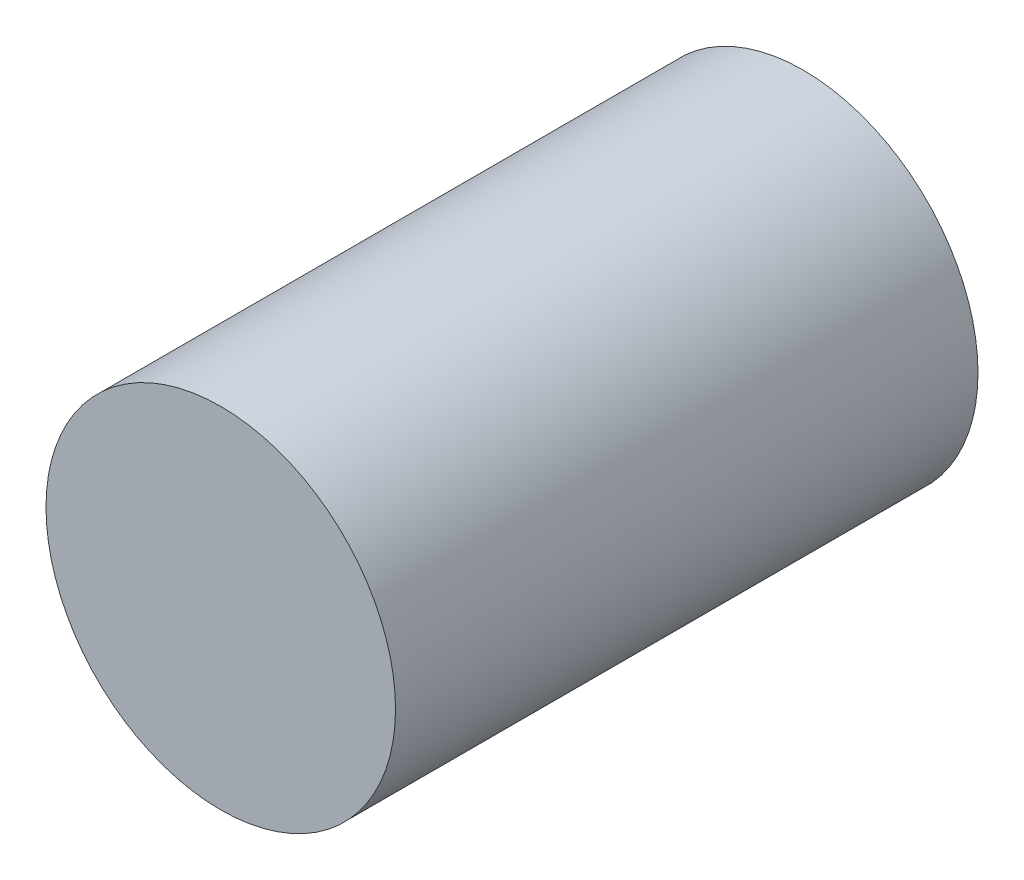
ISO-10303-21;
HEADER;
FILE_DESCRIPTION(('STEP AP214'),'2;1');
FILE_NAME('part.step','',(''),(''),'','','');
FILE_SCHEMA(('AUTOMOTIVE_DESIGN { 1 0 10303 214 1 1 1 1 }'));
ENDSEC;
DATA;
#1=APPLICATION_CONTEXT('core data for automotive mechanical design processes');
#2=APPLICATION_PROTOCOL_DEFINITION('international standard','automotive_design',2000,#1);
#3=PRODUCT_CONTEXT('',#1,'mechanical');
#4=PRODUCT('Part','Part','',(#3));
#5=PRODUCT_RELATED_PRODUCT_CATEGORY('part','',(#4));
#6=PRODUCT_DEFINITION_FORMATION('','',#4);
#7=PRODUCT_DEFINITION_CONTEXT('part definition',#1,'design');
#8=PRODUCT_DEFINITION('design','',#6,#7);
#9=PRODUCT_DEFINITION_SHAPE('','',#8);
#10=(LENGTH_UNIT() NAMED_UNIT(*) SI_UNIT(.MILLI.,.METRE.));
#11=(NAMED_UNIT(*) PLANE_ANGLE_UNIT() SI_UNIT($,.RADIAN.));
#12=(NAMED_UNIT(*) SI_UNIT($,.STERADIAN.) SOLID_ANGLE_UNIT());
#13=UNCERTAINTY_MEASURE_WITH_UNIT(LENGTH_MEASURE(1.E-05),#10,'distance_accuracy_value','');
#14=(GEOMETRIC_REPRESENTATION_CONTEXT(3) GLOBAL_UNCERTAINTY_ASSIGNED_CONTEXT((#13)) GLOBAL_UNIT_ASSIGNED_CONTEXT((#10,
#11,#12)) REPRESENTATION_CONTEXT('',''));
#15=CARTESIAN_POINT('',(0.,0.,0.));
#16=DIRECTION('',(0.,0.,1.));
#17=DIRECTION('',(1.,0.,0.));
#18=AXIS2_PLACEMENT_3D('',#15,#16,#17);
#19=CARTESIAN_POINT('',(0.,0.,0.1));
#20=DIRECTION('',(0.,0.,-1.));
#21=DIRECTION('',(-1.,0.,0.));
#22=AXIS2_PLACEMENT_3D('',#19,#20,#21);
#23=CYLINDRICAL_SURFACE('',#22,0.0299999999999988);
#24=CARTESIAN_POINT('',(0.,0.,0.1));
#25=DIRECTION('',(0.,0.,1.));
#26=DIRECTION('',(1.,0.,0.));
#27=AXIS2_PLACEMENT_3D('',#24,#25,#26);
#28=CIRCLE('',#27,0.0299999999999988);
#29=CARTESIAN_POINT('',(0.0299999999999988,0.,0.1));
#30=VERTEX_POINT('',#29);
#31=EDGE_CURVE('E10',#30,#30,#28,.T.);
#32=ORIENTED_EDGE('',*,*,#31,.F.);
#33=EDGE_LOOP('',(#32));
#34=FACE_BOUND('',#33,.T.);
#35=CARTESIAN_POINT('',(0.,0.,0.));
#36=DIRECTION('',(0.,0.,1.));
#37=DIRECTION('',(1.,0.,0.));
#38=AXIS2_PLACEMENT_3D('',#35,#36,#37);
#39=CIRCLE('',#38,0.0299999999999988);
#40=CARTESIAN_POINT('',(0.0299999999999988,0.,0.));
#41=VERTEX_POINT('',#40);
#42=EDGE_CURVE('E33',#41,#41,#39,.T.);
#43=ORIENTED_EDGE('',*,*,#42,.T.);
#44=EDGE_LOOP('',(#43));
#45=FACE_BOUND('',#44,.T.);
#46=ADVANCED_FACE('F30',(#34,#45),#23,.T.);
#47=CARTESIAN_POINT('',(0.,0.,0.1));
#48=DIRECTION('',(0.,0.,1.));
#49=DIRECTION('',(1.,0.,0.));
#50=AXIS2_PLACEMENT_3D('',#47,#48,#49);
#51=PLANE('',#50);
#52=ORIENTED_EDGE('',*,*,#31,.T.);
#53=EDGE_LOOP('',(#52));
#54=FACE_BOUND('',#53,.T.);
#55=ADVANCED_FACE('F45',(#54),#51,.T.);
#56=CARTESIAN_POINT('',(0.,0.,0.));
#57=DIRECTION('',(0.,0.,1.));
#58=DIRECTION('',(1.,0.,0.));
#59=AXIS2_PLACEMENT_3D('',#56,#57,#58);
#60=PLANE('',#59);
#61=ORIENTED_EDGE('',*,*,#42,.F.);
#62=EDGE_LOOP('',(#61));
#63=FACE_BOUND('',#62,.T.);
#64=ADVANCED_FACE('F43',(#63),#60,.F.);
#65=CLOSED_SHELL('',(#46,#55,#64));
#66=MANIFOLD_SOLID_BREP('B2',#65);
#67=ADVANCED_BREP_SHAPE_REPRESENTATION('',(#18,#66),#14);
#68=SHAPE_DEFINITION_REPRESENTATION(#9,#67);
ENDSEC;
END-ISO-10303-21;
